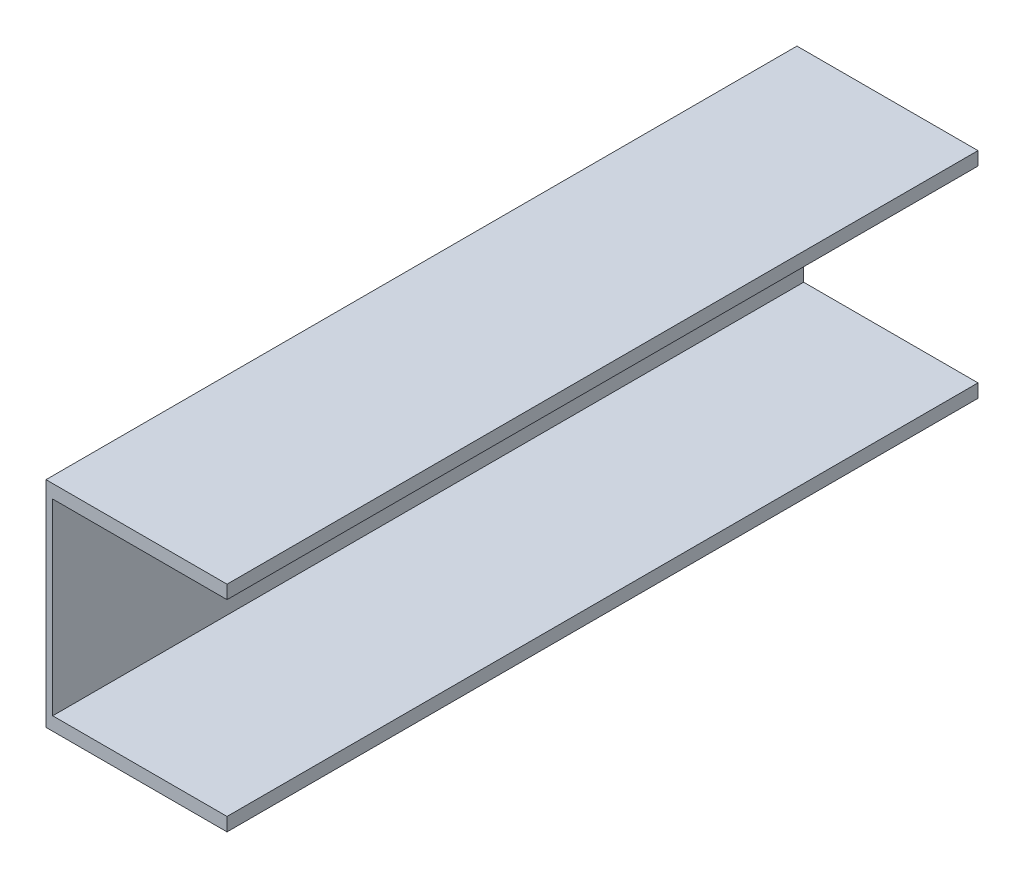
ISO-10303-21;
HEADER;
FILE_DESCRIPTION(('STEP AP214'),'2;1');
FILE_NAME('part.step','',(''),(''),'','','');
FILE_SCHEMA(('AUTOMOTIVE_DESIGN { 1 0 10303 214 1 1 1 1 }'));
ENDSEC;
DATA;
#1=APPLICATION_CONTEXT('core data for automotive mechanical design processes');
#2=APPLICATION_PROTOCOL_DEFINITION('international standard','automotive_design',2000,#1);
#3=PRODUCT_CONTEXT('',#1,'mechanical');
#4=PRODUCT('Part','Part','',(#3));
#5=PRODUCT_RELATED_PRODUCT_CATEGORY('part','',(#4));
#6=PRODUCT_DEFINITION_FORMATION('','',#4);
#7=PRODUCT_DEFINITION_CONTEXT('part definition',#1,'design');
#8=PRODUCT_DEFINITION('design','',#6,#7);
#9=PRODUCT_DEFINITION_SHAPE('','',#8);
#10=(LENGTH_UNIT() NAMED_UNIT(*) SI_UNIT(.MILLI.,.METRE.));
#11=(NAMED_UNIT(*) PLANE_ANGLE_UNIT() SI_UNIT($,.RADIAN.));
#12=(NAMED_UNIT(*) SI_UNIT($,.STERADIAN.) SOLID_ANGLE_UNIT());
#13=UNCERTAINTY_MEASURE_WITH_UNIT(LENGTH_MEASURE(1.E-05),#10,'distance_accuracy_value','');
#14=(GEOMETRIC_REPRESENTATION_CONTEXT(3) GLOBAL_UNCERTAINTY_ASSIGNED_CONTEXT((#13)) GLOBAL_UNIT_ASSIGNED_CONTEXT((#10,
#11,#12)) REPRESENTATION_CONTEXT('',''));
#15=CARTESIAN_POINT('',(0.,0.,0.));
#16=DIRECTION('',(0.,0.,1.));
#17=DIRECTION('',(1.,0.,0.));
#18=AXIS2_PLACEMENT_3D('',#15,#16,#17);
#19=CARTESIAN_POINT('',(3.175,101.6,0.));
#20=DIRECTION('',(-1.,0.,0.));
#21=DIRECTION('',(0.,0.,1.));
#22=AXIS2_PLACEMENT_3D('',#19,#20,#21);
#23=PLANE('',#22);
#24=DIRECTION('',(0.,0.,-1.));
#25=VECTOR('',#24,1.);
#26=CARTESIAN_POINT('',(3.175,95.25,0.));
#27=LINE('',#26,#25);
#28=CARTESIAN_POINT('',(3.175,95.25,0.));
#29=VERTEX_POINT('',#28);
#30=CARTESIAN_POINT('',(3.175,95.25,-355.6));
#31=VERTEX_POINT('',#30);
#32=EDGE_CURVE('E51',#29,#31,#27,.T.);
#33=ORIENTED_EDGE('',*,*,#32,.F.);
#34=DIRECTION('',(0.,-1.,0.));
#35=VECTOR('',#34,1.);
#36=CARTESIAN_POINT('',(3.175,0.,0.));
#37=LINE('',#36,#35);
#38=CARTESIAN_POINT('',(3.175,6.35,0.));
#39=VERTEX_POINT('',#38);
#40=EDGE_CURVE('E37',#29,#39,#37,.T.);
#41=ORIENTED_EDGE('',*,*,#40,.T.);
#42=DIRECTION('',(0.,0.,1.));
#43=VECTOR('',#42,1.);
#44=CARTESIAN_POINT('',(3.175,6.35,0.));
#45=LINE('',#44,#43);
#46=CARTESIAN_POINT('',(3.175,6.34999999999999,-355.6));
#47=VERTEX_POINT('',#46);
#48=EDGE_CURVE('E133',#47,#39,#45,.T.);
#49=ORIENTED_EDGE('',*,*,#48,.F.);
#50=DIRECTION('',(0.,1.,0.));
#51=VECTOR('',#50,1.);
#52=CARTESIAN_POINT('',(3.175,101.6,-355.6));
#53=LINE('',#52,#51);
#54=EDGE_CURVE('E56',#47,#31,#53,.T.);
#55=ORIENTED_EDGE('',*,*,#54,.T.);
#56=EDGE_LOOP('',(#33,#41,#49,#55));
#57=FACE_BOUND('',#56,.T.);
#58=ADVANCED_FACE('F33',(#57),#23,.F.);
#59=CARTESIAN_POINT('',(3.175,0.,0.));
#60=DIRECTION('',(0.,0.,-1.));
#61=DIRECTION('',(-1.,0.,0.));
#62=AXIS2_PLACEMENT_3D('',#59,#60,#61);
#63=PLANE('',#62);
#64=DIRECTION('',(0.,-1.,0.));
#65=VECTOR('',#64,1.);
#66=CARTESIAN_POINT('',(0.,0.,0.));
#67=LINE('',#66,#65);
#68=CARTESIAN_POINT('',(0.,101.6,0.));
#69=VERTEX_POINT('',#68);
#70=CARTESIAN_POINT('',(0.,0.,0.));
#71=VERTEX_POINT('',#70);
#72=EDGE_CURVE('E158',#69,#71,#67,.T.);
#73=ORIENTED_EDGE('',*,*,#72,.T.);
#74=DIRECTION('',(-1.,0.,0.));
#75=VECTOR('',#74,1.);
#76=CARTESIAN_POINT('',(3.175,0.,0.));
#77=LINE('',#76,#75);
#78=CARTESIAN_POINT('',(85.725,0.,0.));
#79=VERTEX_POINT('',#78);
#80=EDGE_CURVE('E11',#79,#71,#77,.T.);
#81=ORIENTED_EDGE('',*,*,#80,.F.);
#82=DIRECTION('',(0.,-1.,0.));
#83=VECTOR('',#82,1.);
#84=CARTESIAN_POINT('',(85.725,0.,0.));
#85=LINE('',#84,#83);
#86=CARTESIAN_POINT('',(85.725,6.35,0.));
#87=VERTEX_POINT('',#86);
#88=EDGE_CURVE('E141',#87,#79,#85,.T.);
#89=ORIENTED_EDGE('',*,*,#88,.F.);
#90=DIRECTION('',(-1.,0.,0.));
#91=VECTOR('',#90,1.);
#92=CARTESIAN_POINT('',(85.725,6.35,0.));
#93=LINE('',#92,#91);
#94=EDGE_CURVE('E144',#87,#39,#93,.T.);
#95=ORIENTED_EDGE('',*,*,#94,.T.);
#96=ORIENTED_EDGE('',*,*,#40,.F.);
#97=DIRECTION('',(-1.,0.,0.));
#98=VECTOR('',#97,1.);
#99=CARTESIAN_POINT('',(85.725,95.25,0.));
#100=LINE('',#99,#98);
#101=CARTESIAN_POINT('',(85.725,95.25,0.));
#102=VERTEX_POINT('',#101);
#103=EDGE_CURVE('E115',#102,#29,#100,.T.);
#104=ORIENTED_EDGE('',*,*,#103,.F.);
#105=DIRECTION('',(0.,-1.,0.));
#106=VECTOR('',#105,1.);
#107=CARTESIAN_POINT('',(85.725,101.6,0.));
#108=LINE('',#107,#106);
#109=CARTESIAN_POINT('',(85.725,101.6,0.));
#110=VERTEX_POINT('',#109);
#111=EDGE_CURVE('E113',#110,#102,#108,.T.);
#112=ORIENTED_EDGE('',*,*,#111,.F.);
#113=DIRECTION('',(-1.,0.,0.));
#114=VECTOR('',#113,1.);
#115=CARTESIAN_POINT('',(3.175,101.6,0.));
#116=LINE('',#115,#114);
#117=EDGE_CURVE('E99',#110,#69,#116,.T.);
#118=ORIENTED_EDGE('',*,*,#117,.T.);
#119=EDGE_LOOP('',(#73,#81,#89,#95,#96,#104,#112,#118));
#120=FACE_BOUND('',#119,.T.);
#121=ADVANCED_FACE('F35',(#120),#63,.F.);
#122=CARTESIAN_POINT('',(3.175,0.,0.));
#123=DIRECTION('',(0.,1.,0.));
#124=DIRECTION('',(0.,0.,1.));
#125=AXIS2_PLACEMENT_3D('',#122,#123,#124);
#126=PLANE('',#125);
#127=DIRECTION('',(0.,0.,-1.));
#128=VECTOR('',#127,1.);
#129=CARTESIAN_POINT('',(0.,0.,0.));
#130=LINE('',#129,#128);
#131=CARTESIAN_POINT('',(0.,0.,-355.6));
#132=VERTEX_POINT('',#131);
#133=EDGE_CURVE('E163',#71,#132,#130,.T.);
#134=ORIENTED_EDGE('',*,*,#133,.T.);
#135=DIRECTION('',(-1.,0.,0.));
#136=VECTOR('',#135,1.);
#137=CARTESIAN_POINT('',(3.175,0.,-355.6));
#138=LINE('',#137,#136);
#139=CARTESIAN_POINT('',(85.725,0.,-355.6));
#140=VERTEX_POINT('',#139);
#141=EDGE_CURVE('E43',#140,#132,#138,.T.);
#142=ORIENTED_EDGE('',*,*,#141,.F.);
#143=DIRECTION('',(0.,0.,-1.));
#144=VECTOR('',#143,1.);
#145=CARTESIAN_POINT('',(85.725,0.,-355.6));
#146=LINE('',#145,#144);
#147=EDGE_CURVE('E134',#79,#140,#146,.T.);
#148=ORIENTED_EDGE('',*,*,#147,.F.);
#149=ORIENTED_EDGE('',*,*,#80,.T.);
#150=EDGE_LOOP('',(#134,#142,#148,#149));
#151=FACE_BOUND('',#150,.T.);
#152=ADVANCED_FACE('F181',(#151),#126,.F.);
#153=CARTESIAN_POINT('',(3.175,101.6,-355.6));
#154=DIRECTION('',(0.,0.,1.));
#155=DIRECTION('',(1.,0.,0.));
#156=AXIS2_PLACEMENT_3D('',#153,#154,#155);
#157=PLANE('',#156);
#158=DIRECTION('',(0.,1.,0.));
#159=VECTOR('',#158,1.);
#160=CARTESIAN_POINT('',(0.,101.6,-355.6));
#161=LINE('',#160,#159);
#162=CARTESIAN_POINT('',(0.,101.6,-355.6));
#163=VERTEX_POINT('',#162);
#164=EDGE_CURVE('E165',#132,#163,#161,.T.);
#165=ORIENTED_EDGE('',*,*,#164,.T.);
#166=DIRECTION('',(-1.,0.,0.));
#167=VECTOR('',#166,1.);
#168=CARTESIAN_POINT('',(3.175,101.6,-355.6));
#169=LINE('',#168,#167);
#170=CARTESIAN_POINT('',(85.725,101.6,-355.6));
#171=VERTEX_POINT('',#170);
#172=EDGE_CURVE('E110',#171,#163,#169,.T.);
#173=ORIENTED_EDGE('',*,*,#172,.F.);
#174=DIRECTION('',(0.,1.,0.));
#175=VECTOR('',#174,1.);
#176=CARTESIAN_POINT('',(85.725,95.25,-355.6));
#177=LINE('',#176,#175);
#178=CARTESIAN_POINT('',(85.725,95.25,-355.6));
#179=VERTEX_POINT('',#178);
#180=EDGE_CURVE('E123',#179,#171,#177,.T.);
#181=ORIENTED_EDGE('',*,*,#180,.F.);
#182=DIRECTION('',(-1.,0.,0.));
#183=VECTOR('',#182,1.);
#184=CARTESIAN_POINT('',(85.725,95.25,-355.6));
#185=LINE('',#184,#183);
#186=EDGE_CURVE('E128',#179,#31,#185,.T.);
#187=ORIENTED_EDGE('',*,*,#186,.T.);
#188=ORIENTED_EDGE('',*,*,#54,.F.);
#189=DIRECTION('',(-1.,0.,0.));
#190=VECTOR('',#189,1.);
#191=CARTESIAN_POINT('',(85.725,6.35,-355.6));
#192=LINE('',#191,#190);
#193=CARTESIAN_POINT('',(85.725,6.35,-355.6));
#194=VERTEX_POINT('',#193);
#195=EDGE_CURVE('E154',#194,#47,#192,.T.);
#196=ORIENTED_EDGE('',*,*,#195,.F.);
#197=DIRECTION('',(0.,1.,0.));
#198=VECTOR('',#197,1.);
#199=CARTESIAN_POINT('',(85.725,6.35,-355.6));
#200=LINE('',#199,#198);
#201=EDGE_CURVE('E137',#140,#194,#200,.T.);
#202=ORIENTED_EDGE('',*,*,#201,.F.);
#203=ORIENTED_EDGE('',*,*,#141,.T.);
#204=EDGE_LOOP('',(#165,#173,#181,#187,#188,#196,#202,#203));
#205=FACE_BOUND('',#204,.T.);
#206=ADVANCED_FACE('F176',(#205),#157,.F.);
#207=CARTESIAN_POINT('',(3.175,101.6,0.));
#208=DIRECTION('',(0.,-1.,0.));
#209=DIRECTION('',(0.,0.,-1.));
#210=AXIS2_PLACEMENT_3D('',#207,#208,#209);
#211=PLANE('',#210);
#212=DIRECTION('',(0.,0.,1.));
#213=VECTOR('',#212,1.);
#214=CARTESIAN_POINT('',(0.,101.6,0.));
#215=LINE('',#214,#213);
#216=EDGE_CURVE('E106',#163,#69,#215,.T.);
#217=ORIENTED_EDGE('',*,*,#216,.T.);
#218=ORIENTED_EDGE('',*,*,#117,.F.);
#219=DIRECTION('',(0.,0.,1.));
#220=VECTOR('',#219,1.);
#221=CARTESIAN_POINT('',(85.725,101.6,-355.6));
#222=LINE('',#221,#220);
#223=EDGE_CURVE('E104',#171,#110,#222,.T.);
#224=ORIENTED_EDGE('',*,*,#223,.F.);
#225=ORIENTED_EDGE('',*,*,#172,.T.);
#226=EDGE_LOOP('',(#217,#218,#224,#225));
#227=FACE_BOUND('',#226,.T.);
#228=ADVANCED_FACE('F101',(#227),#211,.F.);
#229=CARTESIAN_POINT('',(0.,101.6,0.));
#230=DIRECTION('',(-1.,0.,0.));
#231=DIRECTION('',(0.,0.,1.));
#232=AXIS2_PLACEMENT_3D('',#229,#230,#231);
#233=PLANE('',#232);
#234=ORIENTED_EDGE('',*,*,#72,.F.);
#235=ORIENTED_EDGE('',*,*,#216,.F.);
#236=ORIENTED_EDGE('',*,*,#164,.F.);
#237=ORIENTED_EDGE('',*,*,#133,.F.);
#238=EDGE_LOOP('',(#234,#235,#236,#237));
#239=FACE_BOUND('',#238,.T.);
#240=ADVANCED_FACE('F180',(#239),#233,.T.);
#241=CARTESIAN_POINT('',(85.725,6.35,0.));
#242=DIRECTION('',(0.,-1.,0.));
#243=DIRECTION('',(0.,0.,-1.));
#244=AXIS2_PLACEMENT_3D('',#241,#242,#243);
#245=PLANE('',#244);
#246=ORIENTED_EDGE('',*,*,#48,.T.);
#247=ORIENTED_EDGE('',*,*,#94,.F.);
#248=DIRECTION('',(0.,0.,1.));
#249=VECTOR('',#248,1.);
#250=CARTESIAN_POINT('',(85.725,6.35,0.));
#251=LINE('',#250,#249);
#252=EDGE_CURVE('E139',#194,#87,#251,.T.);
#253=ORIENTED_EDGE('',*,*,#252,.F.);
#254=ORIENTED_EDGE('',*,*,#195,.T.);
#255=EDGE_LOOP('',(#246,#247,#253,#254));
#256=FACE_BOUND('',#255,.T.);
#257=ADVANCED_FACE('F186',(#256),#245,.F.);
#258=CARTESIAN_POINT('',(85.725,0.,0.));
#259=DIRECTION('',(-1.,0.,0.));
#260=DIRECTION('',(0.,0.,1.));
#261=AXIS2_PLACEMENT_3D('',#258,#259,#260);
#262=PLANE('',#261);
#263=ORIENTED_EDGE('',*,*,#147,.T.);
#264=ORIENTED_EDGE('',*,*,#201,.T.);
#265=ORIENTED_EDGE('',*,*,#252,.T.);
#266=ORIENTED_EDGE('',*,*,#88,.T.);
#267=EDGE_LOOP('',(#263,#264,#265,#266));
#268=FACE_BOUND('',#267,.T.);
#269=ADVANCED_FACE('F184',(#268),#262,.F.);
#270=CARTESIAN_POINT('',(85.725,95.25,0.));
#271=DIRECTION('',(0.,1.,0.));
#272=DIRECTION('',(0.,0.,1.));
#273=AXIS2_PLACEMENT_3D('',#270,#271,#272);
#274=PLANE('',#273);
#275=ORIENTED_EDGE('',*,*,#32,.T.);
#276=ORIENTED_EDGE('',*,*,#186,.F.);
#277=DIRECTION('',(0.,0.,-1.));
#278=VECTOR('',#277,1.);
#279=CARTESIAN_POINT('',(85.725,95.25,0.));
#280=LINE('',#279,#278);
#281=EDGE_CURVE('E118',#102,#179,#280,.T.);
#282=ORIENTED_EDGE('',*,*,#281,.F.);
#283=ORIENTED_EDGE('',*,*,#103,.T.);
#284=EDGE_LOOP('',(#275,#276,#282,#283));
#285=FACE_BOUND('',#284,.T.);
#286=ADVANCED_FACE('F188',(#285),#274,.F.);
#287=CARTESIAN_POINT('',(85.725,101.6,0.));
#288=DIRECTION('',(1.,0.,0.));
#289=DIRECTION('',(0.,0.,-1.));
#290=AXIS2_PLACEMENT_3D('',#287,#288,#289);
#291=PLANE('',#290);
#292=ORIENTED_EDGE('',*,*,#223,.T.);
#293=ORIENTED_EDGE('',*,*,#111,.T.);
#294=ORIENTED_EDGE('',*,*,#281,.T.);
#295=ORIENTED_EDGE('',*,*,#180,.T.);
#296=EDGE_LOOP('',(#292,#293,#294,#295));
#297=FACE_BOUND('',#296,.T.);
#298=ADVANCED_FACE('F121',(#297),#291,.T.);
#299=CLOSED_SHELL('',(#58,#121,#152,#206,#228,#240,#257,#269,#286,#298));
#300=MANIFOLD_SOLID_BREP('B2',#299);
#301=ADVANCED_BREP_SHAPE_REPRESENTATION('',(#18,#300),#14);
#302=SHAPE_DEFINITION_REPRESENTATION(#9,#301);
ENDSEC;
END-ISO-10303-21;
